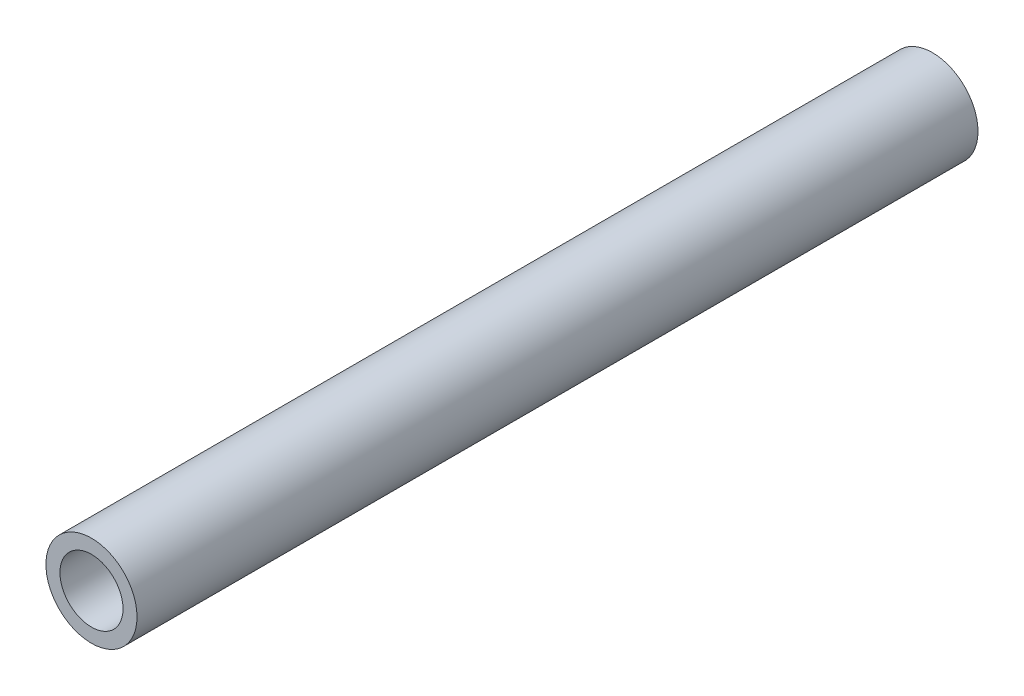
ISO-10303-21;
HEADER;
FILE_DESCRIPTION(('STEP AP214'),'2;1');
FILE_NAME('part.step','',(''),(''),'','','');
FILE_SCHEMA(('AUTOMOTIVE_DESIGN { 1 0 10303 214 1 1 1 1 }'));
ENDSEC;
DATA;
#1=APPLICATION_CONTEXT('core data for automotive mechanical design processes');
#2=APPLICATION_PROTOCOL_DEFINITION('international standard','automotive_design',2000,#1);
#3=PRODUCT_CONTEXT('',#1,'mechanical');
#4=PRODUCT('Part','Part','',(#3));
#5=PRODUCT_RELATED_PRODUCT_CATEGORY('part','',(#4));
#6=PRODUCT_DEFINITION_FORMATION('','',#4);
#7=PRODUCT_DEFINITION_CONTEXT('part definition',#1,'design');
#8=PRODUCT_DEFINITION('design','',#6,#7);
#9=PRODUCT_DEFINITION_SHAPE('','',#8);
#10=(LENGTH_UNIT() NAMED_UNIT(*) SI_UNIT(.MILLI.,.METRE.));
#11=(NAMED_UNIT(*) PLANE_ANGLE_UNIT() SI_UNIT($,.RADIAN.));
#12=(NAMED_UNIT(*) SI_UNIT($,.STERADIAN.) SOLID_ANGLE_UNIT());
#13=UNCERTAINTY_MEASURE_WITH_UNIT(LENGTH_MEASURE(1.E-05),#10,'distance_accuracy_value','');
#14=(GEOMETRIC_REPRESENTATION_CONTEXT(3) GLOBAL_UNCERTAINTY_ASSIGNED_CONTEXT((#13)) GLOBAL_UNIT_ASSIGNED_CONTEXT((#10,
#11,#12)) REPRESENTATION_CONTEXT('',''));
#15=CARTESIAN_POINT('',(0.,0.,0.));
#16=DIRECTION('',(0.,0.,1.));
#17=DIRECTION('',(1.,0.,0.));
#18=AXIS2_PLACEMENT_3D('',#15,#16,#17);
#19=CARTESIAN_POINT('',(0.,0.,120.));
#20=DIRECTION('',(0.,0.,1.));
#21=DIRECTION('',(1.,0.,0.));
#22=AXIS2_PLACEMENT_3D('',#19,#20,#21);
#23=PLANE('',#22);
#24=CARTESIAN_POINT('',(0.,0.,120.));
#25=DIRECTION('',(0.,0.,1.));
#26=DIRECTION('',(1.,0.,0.));
#27=AXIS2_PLACEMENT_3D('',#24,#25,#26);
#28=CIRCLE('',#27,6.5);
#29=CARTESIAN_POINT('',(6.5,0.,120.));
#30=VERTEX_POINT('',#29);
#31=EDGE_CURVE('E10',#30,#30,#28,.T.);
#32=ORIENTED_EDGE('',*,*,#31,.T.);
#33=EDGE_LOOP('',(#32));
#34=FACE_BOUND('',#33,.T.);
#35=CARTESIAN_POINT('',(0.,0.,120.));
#36=DIRECTION('',(0.,0.,1.));
#37=DIRECTION('',(1.,0.,0.));
#38=AXIS2_PLACEMENT_3D('',#35,#36,#37);
#39=CIRCLE('',#38,4.5);
#40=CARTESIAN_POINT('',(4.5,0.,120.));
#41=VERTEX_POINT('',#40);
#42=EDGE_CURVE('E44',#41,#41,#39,.T.);
#43=ORIENTED_EDGE('',*,*,#42,.F.);
#44=EDGE_LOOP('',(#43));
#45=FACE_BOUND('',#44,.T.);
#46=ADVANCED_FACE('F33',(#34,#45),#23,.T.);
#47=CARTESIAN_POINT('',(0.,0.,0.));
#48=DIRECTION('',(0.,0.,1.));
#49=DIRECTION('',(1.,0.,0.));
#50=AXIS2_PLACEMENT_3D('',#47,#48,#49);
#51=PLANE('',#50);
#52=CARTESIAN_POINT('',(0.,0.,0.));
#53=DIRECTION('',(0.,0.,1.));
#54=DIRECTION('',(1.,0.,0.));
#55=AXIS2_PLACEMENT_3D('',#52,#53,#54);
#56=CIRCLE('',#55,6.5);
#57=CARTESIAN_POINT('',(6.5,0.,0.));
#58=VERTEX_POINT('',#57);
#59=EDGE_CURVE('E37',#58,#58,#56,.T.);
#60=ORIENTED_EDGE('',*,*,#59,.F.);
#61=EDGE_LOOP('',(#60));
#62=FACE_BOUND('',#61,.T.);
#63=CARTESIAN_POINT('',(0.,0.,0.));
#64=DIRECTION('',(0.,0.,1.));
#65=DIRECTION('',(1.,0.,0.));
#66=AXIS2_PLACEMENT_3D('',#63,#64,#65);
#67=CIRCLE('',#66,4.5);
#68=CARTESIAN_POINT('',(4.5,0.,0.));
#69=VERTEX_POINT('',#68);
#70=EDGE_CURVE('E46',#69,#69,#67,.T.);
#71=ORIENTED_EDGE('',*,*,#70,.T.);
#72=EDGE_LOOP('',(#71));
#73=FACE_BOUND('',#72,.T.);
#74=ADVANCED_FACE('F56',(#62,#73),#51,.F.);
#75=CARTESIAN_POINT('',(0.,0.,120.));
#76=DIRECTION('',(0.,0.,-1.));
#77=DIRECTION('',(-1.,0.,0.));
#78=AXIS2_PLACEMENT_3D('',#75,#76,#77);
#79=CYLINDRICAL_SURFACE('',#78,6.5);
#80=ORIENTED_EDGE('',*,*,#31,.F.);
#81=EDGE_LOOP('',(#80));
#82=FACE_BOUND('',#81,.T.);
#83=ORIENTED_EDGE('',*,*,#59,.T.);
#84=EDGE_LOOP('',(#83));
#85=FACE_BOUND('',#84,.T.);
#86=ADVANCED_FACE('F35',(#82,#85),#79,.T.);
#87=CARTESIAN_POINT('',(0.,0.,120.));
#88=DIRECTION('',(0.,0.,-1.));
#89=DIRECTION('',(-1.,0.,0.));
#90=AXIS2_PLACEMENT_3D('',#87,#88,#89);
#91=CYLINDRICAL_SURFACE('',#90,4.5);
#92=ORIENTED_EDGE('',*,*,#42,.T.);
#93=EDGE_LOOP('',(#92));
#94=FACE_BOUND('',#93,.T.);
#95=ORIENTED_EDGE('',*,*,#70,.F.);
#96=EDGE_LOOP('',(#95));
#97=FACE_BOUND('',#96,.T.);
#98=ADVANCED_FACE('F52',(#94,#97),#91,.F.);
#99=CLOSED_SHELL('',(#46,#74,#86,#98));
#100=MANIFOLD_SOLID_BREP('B2',#99);
#101=ADVANCED_BREP_SHAPE_REPRESENTATION('',(#18,#100),#14);
#102=SHAPE_DEFINITION_REPRESENTATION(#9,#101);
ENDSEC;
END-ISO-10303-21;
